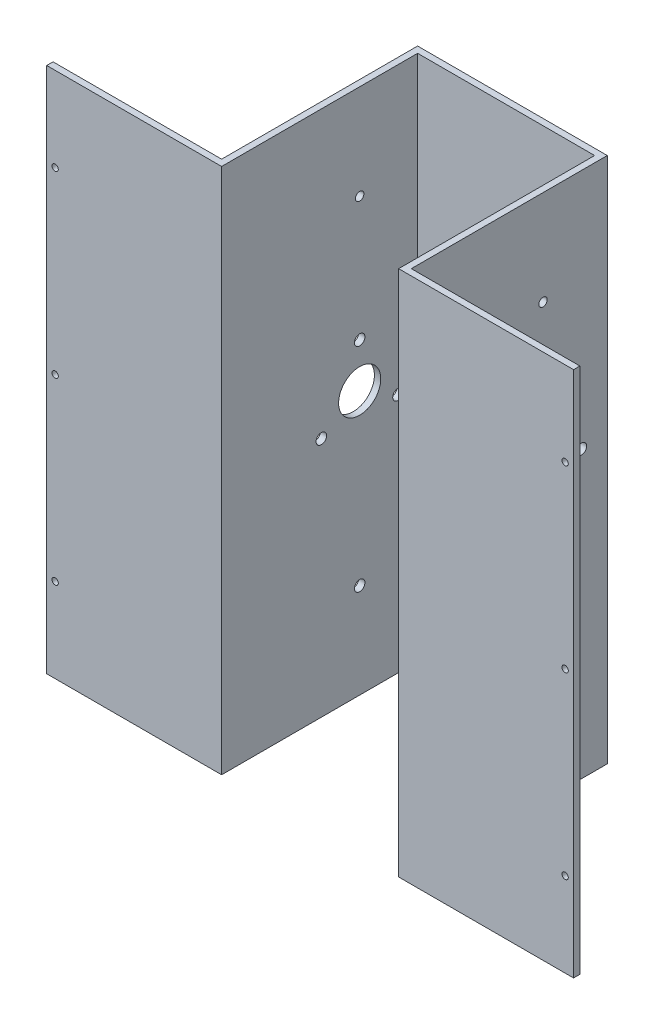
ISO-10303-21;
HEADER;
FILE_DESCRIPTION(('STEP AP214'),'2;1');
FILE_NAME('part.step','',(''),(''),'','','');
FILE_SCHEMA(('AUTOMOTIVE_DESIGN { 1 0 10303 214 1 1 1 1 }'));
ENDSEC;
DATA;
#1=APPLICATION_CONTEXT('core data for automotive mechanical design processes');
#2=APPLICATION_PROTOCOL_DEFINITION('international standard','automotive_design',2000,#1);
#3=PRODUCT_CONTEXT('',#1,'mechanical');
#4=PRODUCT('Part','Part','',(#3));
#5=PRODUCT_RELATED_PRODUCT_CATEGORY('part','',(#4));
#6=PRODUCT_DEFINITION_FORMATION('','',#4);
#7=PRODUCT_DEFINITION_CONTEXT('part definition',#1,'design');
#8=PRODUCT_DEFINITION('design','',#6,#7);
#9=PRODUCT_DEFINITION_SHAPE('','',#8);
#10=(LENGTH_UNIT() NAMED_UNIT(*) SI_UNIT(.MILLI.,.METRE.));
#11=(NAMED_UNIT(*) PLANE_ANGLE_UNIT() SI_UNIT($,.RADIAN.));
#12=(NAMED_UNIT(*) SI_UNIT($,.STERADIAN.) SOLID_ANGLE_UNIT());
#13=UNCERTAINTY_MEASURE_WITH_UNIT(LENGTH_MEASURE(1.E-05),#10,'distance_accuracy_value','');
#14=(GEOMETRIC_REPRESENTATION_CONTEXT(3) GLOBAL_UNCERTAINTY_ASSIGNED_CONTEXT((#13)) GLOBAL_UNIT_ASSIGNED_CONTEXT((#10,
#11,#12)) REPRESENTATION_CONTEXT('',''));
#15=CARTESIAN_POINT('',(0.,0.,0.));
#16=DIRECTION('',(0.,0.,1.));
#17=DIRECTION('',(1.,0.,0.));
#18=AXIS2_PLACEMENT_3D('',#15,#16,#17);
#19=CARTESIAN_POINT('',(40.1289777943499,0.,96.));
#20=DIRECTION('',(0.,0.,-1.));
#21=DIRECTION('',(1.,0.,0.));
#22=AXIS2_PLACEMENT_3D('',#19,#20,#21);
#23=PLANE('',#22);
#24=CARTESIAN_POINT('',(141.064488897175,-165.979780033841,96.));
#25=DIRECTION('',(0.,0.,-1.));
#26=DIRECTION('',(-1.,0.,0.));
#27=AXIS2_PLACEMENT_3D('',#24,#25,#26);
#28=CIRCLE('',#27,1.5);
#29=CARTESIAN_POINT('',(139.564488897175,-165.979780033841,96.));
#30=VERTEX_POINT('',#29);
#31=EDGE_CURVE('E702',#30,#30,#28,.T.);
#32=ORIENTED_EDGE('',*,*,#31,.T.);
#33=EDGE_LOOP('',(#32));
#34=FACE_BOUND('',#33,.T.);
#35=DIRECTION('',(0.,1.,0.));
#36=VECTOR('',#35,1.);
#37=CARTESIAN_POINT('',(62.0644888971749,44.0202199661591,96.));
#38=LINE('',#37,#36);
#39=CARTESIAN_POINT('',(62.064488897175,-205.979780033841,96.));
#40=VERTEX_POINT('',#39);
#41=CARTESIAN_POINT('',(62.0644888971749,44.0202199661591,96.));
#42=VERTEX_POINT('',#41);
#43=EDGE_CURVE('E128',#40,#42,#38,.T.);
#44=ORIENTED_EDGE('',*,*,#43,.F.);
#45=DIRECTION('',(-1.,0.,0.));
#46=VECTOR('',#45,1.);
#47=CARTESIAN_POINT('',(62.064488897175,-205.979780033841,96.));
#48=LINE('',#47,#46);
#49=CARTESIAN_POINT('',(145.064488897175,-205.979780033841,96.));
#50=VERTEX_POINT('',#49);
#51=EDGE_CURVE('E141',#50,#40,#48,.T.);
#52=ORIENTED_EDGE('',*,*,#51,.F.);
#53=DIRECTION('',(0.,-1.,0.));
#54=VECTOR('',#53,1.);
#55=CARTESIAN_POINT('',(145.064488897175,44.0202199661591,96.));
#56=LINE('',#55,#54);
#57=CARTESIAN_POINT('',(145.064488897175,44.0202199661591,96.));
#58=VERTEX_POINT('',#57);
#59=EDGE_CURVE('E150',#58,#50,#56,.T.);
#60=ORIENTED_EDGE('',*,*,#59,.F.);
#61=DIRECTION('',(1.,0.,0.));
#62=VECTOR('',#61,1.);
#63=CARTESIAN_POINT('',(62.0644888971749,44.0202199661591,96.));
#64=LINE('',#63,#62);
#65=EDGE_CURVE('E144',#42,#58,#64,.T.);
#66=ORIENTED_EDGE('',*,*,#65,.F.);
#67=EDGE_LOOP('',(#44,#52,#60,#66));
#68=FACE_BOUND('',#67,.T.);
#69=CARTESIAN_POINT('',(141.064488897175,-80.9797800338409,96.));
#70=DIRECTION('',(0.,0.,-1.));
#71=DIRECTION('',(-1.,0.,0.));
#72=AXIS2_PLACEMENT_3D('',#69,#70,#71);
#73=CIRCLE('',#72,1.5);
#74=CARTESIAN_POINT('',(139.564488897175,-80.9797800338409,96.));
#75=VERTEX_POINT('',#74);
#76=EDGE_CURVE('E708',#75,#75,#73,.T.);
#77=ORIENTED_EDGE('',*,*,#76,.T.);
#78=EDGE_LOOP('',(#77));
#79=FACE_BOUND('',#78,.T.);
#80=CARTESIAN_POINT('',(141.064488897175,4.02021996615911,96.));
#81=DIRECTION('',(0.,0.,-1.));
#82=DIRECTION('',(-1.,0.,0.));
#83=AXIS2_PLACEMENT_3D('',#80,#81,#82);
#84=CIRCLE('',#83,1.5);
#85=CARTESIAN_POINT('',(139.564488897175,4.02021996615911,96.));
#86=VERTEX_POINT('',#85);
#87=EDGE_CURVE('E696',#86,#86,#84,.T.);
#88=ORIENTED_EDGE('',*,*,#87,.T.);
#89=EDGE_LOOP('',(#88));
#90=FACE_BOUND('',#89,.T.);
#91=ADVANCED_FACE('F33',(#34,#68,#79,#90),#23,.F.);
#92=CARTESIAN_POINT('',(40.1289777943499,0.,93.));
#93=DIRECTION('',(0.,0.,-1.));
#94=DIRECTION('',(1.,0.,0.));
#95=AXIS2_PLACEMENT_3D('',#92,#93,#94);
#96=PLANE('',#95);
#97=CARTESIAN_POINT('',(141.064488897175,-165.979780033841,93.));
#98=DIRECTION('',(0.,0.,-1.));
#99=DIRECTION('',(-1.,0.,0.));
#100=AXIS2_PLACEMENT_3D('',#97,#98,#99);
#101=CIRCLE('',#100,1.5);
#102=CARTESIAN_POINT('',(139.564488897175,-165.979780033841,93.));
#103=VERTEX_POINT('',#102);
#104=EDGE_CURVE('E705',#103,#103,#101,.T.);
#105=ORIENTED_EDGE('',*,*,#104,.F.);
#106=EDGE_LOOP('',(#105));
#107=FACE_BOUND('',#106,.T.);
#108=DIRECTION('',(-1.,0.,0.));
#109=VECTOR('',#108,1.);
#110=CARTESIAN_POINT('',(62.064488897175,-205.979780033841,93.));
#111=LINE('',#110,#109);
#112=CARTESIAN_POINT('',(145.064488897175,-205.979780033841,93.));
#113=VERTEX_POINT('',#112);
#114=CARTESIAN_POINT('',(65.064488897175,-205.979780033841,93.));
#115=VERTEX_POINT('',#114);
#116=EDGE_CURVE('E157',#113,#115,#111,.T.);
#117=ORIENTED_EDGE('',*,*,#116,.T.);
#118=DIRECTION('',(0.,-1.,0.));
#119=VECTOR('',#118,1.);
#120=CARTESIAN_POINT('',(65.0644888971749,44.0202199661591,93.));
#121=LINE('',#120,#119);
#122=CARTESIAN_POINT('',(65.0644888971749,44.0202199661591,93.));
#123=VERTEX_POINT('',#122);
#124=EDGE_CURVE('E135',#123,#115,#121,.T.);
#125=ORIENTED_EDGE('',*,*,#124,.F.);
#126=DIRECTION('',(1.,0.,0.));
#127=VECTOR('',#126,1.);
#128=CARTESIAN_POINT('',(62.0644888971749,44.0202199661591,93.));
#129=LINE('',#128,#127);
#130=CARTESIAN_POINT('',(145.064488897175,44.0202199661591,93.));
#131=VERTEX_POINT('',#130);
#132=EDGE_CURVE('E145',#123,#131,#129,.T.);
#133=ORIENTED_EDGE('',*,*,#132,.T.);
#134=DIRECTION('',(0.,-1.,0.));
#135=VECTOR('',#134,1.);
#136=CARTESIAN_POINT('',(145.064488897175,44.0202199661591,93.));
#137=LINE('',#136,#135);
#138=EDGE_CURVE('E159',#131,#113,#137,.T.);
#139=ORIENTED_EDGE('',*,*,#138,.T.);
#140=EDGE_LOOP('',(#117,#125,#133,#139));
#141=FACE_BOUND('',#140,.T.);
#142=CARTESIAN_POINT('',(141.064488897175,-80.9797800338409,93.));
#143=DIRECTION('',(0.,0.,-1.));
#144=DIRECTION('',(-1.,0.,0.));
#145=AXIS2_PLACEMENT_3D('',#142,#143,#144);
#146=CIRCLE('',#145,1.5);
#147=CARTESIAN_POINT('',(139.564488897175,-80.9797800338409,93.));
#148=VERTEX_POINT('',#147);
#149=EDGE_CURVE('E160',#148,#148,#146,.T.);
#150=ORIENTED_EDGE('',*,*,#149,.F.);
#151=EDGE_LOOP('',(#150));
#152=FACE_BOUND('',#151,.T.);
#153=CARTESIAN_POINT('',(141.064488897175,4.02021996615911,93.));
#154=DIRECTION('',(0.,0.,-1.));
#155=DIRECTION('',(-1.,0.,0.));
#156=AXIS2_PLACEMENT_3D('',#153,#154,#155);
#157=CIRCLE('',#156,1.5);
#158=CARTESIAN_POINT('',(139.564488897175,4.02021996615911,93.));
#159=VERTEX_POINT('',#158);
#160=EDGE_CURVE('E699',#159,#159,#157,.T.);
#161=ORIENTED_EDGE('',*,*,#160,.F.);
#162=EDGE_LOOP('',(#161));
#163=FACE_BOUND('',#162,.T.);
#164=ADVANCED_FACE('F301',(#107,#141,#152,#163),#96,.T.);
#165=CARTESIAN_POINT('',(-24.9355111028251,44.0202199661591,3.));
#166=DIRECTION('',(1.,0.,0.));
#167=DIRECTION('',(0.,1.,0.));
#168=AXIS2_PLACEMENT_3D('',#165,#166,#167);
#169=PLANE('',#168);
#170=CARTESIAN_POINT('',(-24.9355111028251,-91.4797800338417,48.6865334794728));
#171=DIRECTION('',(-1.,0.,0.));
#172=DIRECTION('',(0.,-1.,0.));
#173=AXIS2_PLACEMENT_3D('',#170,#171,#172);
#174=CIRCLE('',#173,2.50000000000011);
#175=CARTESIAN_POINT('',(-24.9355111028251,-93.9797800338418,48.6865334794728));
#176=VERTEX_POINT('',#175);
#177=EDGE_CURVE('E196',#176,#176,#174,.T.);
#178=ORIENTED_EDGE('',*,*,#177,.F.);
#179=EDGE_LOOP('',(#178));
#180=FACE_BOUND('',#179,.T.);
#181=CARTESIAN_POINT('',(-24.9355111028251,-91.4797800338404,12.3134665205265));
#182=DIRECTION('',(-1.,0.,0.));
#183=DIRECTION('',(0.,-1.,0.));
#184=AXIS2_PLACEMENT_3D('',#181,#182,#183);
#185=CIRCLE('',#184,2.50000000000012);
#186=CARTESIAN_POINT('',(-24.9355111028251,-93.9797800338405,12.3134665205265));
#187=VERTEX_POINT('',#186);
#188=EDGE_CURVE('E202',#187,#187,#185,.T.);
#189=ORIENTED_EDGE('',*,*,#188,.F.);
#190=EDGE_LOOP('',(#189));
#191=FACE_BOUND('',#190,.T.);
#192=CARTESIAN_POINT('',(-24.9355111028251,-59.9797800338409,30.5000000000008));
#193=DIRECTION('',(-1.,0.,0.));
#194=DIRECTION('',(0.,-1.,0.));
#195=AXIS2_PLACEMENT_3D('',#192,#193,#194);
#196=CIRCLE('',#195,2.50000000000012);
#197=CARTESIAN_POINT('',(-24.9355111028251,-62.479780033841,30.5000000000008));
#198=VERTEX_POINT('',#197);
#199=EDGE_CURVE('E208',#198,#198,#196,.T.);
#200=ORIENTED_EDGE('',*,*,#199,.F.);
#201=EDGE_LOOP('',(#200));
#202=FACE_BOUND('',#201,.T.);
#203=CARTESIAN_POINT('',(-24.9355111028251,-160.97978003384,30.4999999999963));
#204=DIRECTION('',(-1.,0.,0.));
#205=DIRECTION('',(0.,-1.,0.));
#206=AXIS2_PLACEMENT_3D('',#203,#204,#205);
#207=CIRCLE('',#206,2.50000000000328);
#208=CARTESIAN_POINT('',(-24.9355111028251,-163.479780033844,30.4999999999963));
#209=VERTEX_POINT('',#208);
#210=EDGE_CURVE('E214',#209,#209,#207,.T.);
#211=ORIENTED_EDGE('',*,*,#210,.F.);
#212=EDGE_LOOP('',(#211));
#213=FACE_BOUND('',#212,.T.);
#214=CARTESIAN_POINT('',(-24.9355111028251,-80.9797800338409,30.5));
#215=DIRECTION('',(-1.,0.,0.));
#216=DIRECTION('',(0.,-1.,0.));
#217=AXIS2_PLACEMENT_3D('',#214,#215,#216);
#218=CIRCLE('',#217,9.99999999999999);
#219=CARTESIAN_POINT('',(-24.9355111028251,-90.9797800338409,30.5));
#220=VERTEX_POINT('',#219);
#221=EDGE_CURVE('E220',#220,#220,#218,.T.);
#222=ORIENTED_EDGE('',*,*,#221,.F.);
#223=EDGE_LOOP('',(#222));
#224=FACE_BOUND('',#223,.T.);
#225=CARTESIAN_POINT('',(-24.9355111028251,-0.979780033840474,30.4999999999963));
#226=DIRECTION('',(-1.,0.,0.));
#227=DIRECTION('',(0.,-1.,0.));
#228=AXIS2_PLACEMENT_3D('',#225,#226,#227);
#229=CIRCLE('',#228,2.00000000000327);
#230=CARTESIAN_POINT('',(-24.9355111028251,-2.97978003384375,30.4999999999963));
#231=VERTEX_POINT('',#230);
#232=EDGE_CURVE('E226',#231,#231,#229,.T.);
#233=ORIENTED_EDGE('',*,*,#232,.F.);
#234=EDGE_LOOP('',(#233));
#235=FACE_BOUND('',#234,.T.);
#236=DIRECTION('',(0.,-1.,0.));
#237=VECTOR('',#236,1.);
#238=CARTESIAN_POINT('',(-24.9355111028251,44.0202199661591,0.));
#239=LINE('',#238,#237);
#240=CARTESIAN_POINT('',(-24.9355111028251,44.0202199661591,0.));
#241=VERTEX_POINT('',#240);
#242=CARTESIAN_POINT('',(-24.935511102825,-205.979780033841,0.));
#243=VERTEX_POINT('',#242);
#244=EDGE_CURVE('E283',#241,#243,#239,.T.);
#245=ORIENTED_EDGE('',*,*,#244,.T.);
#246=DIRECTION('',(0.,0.,-1.));
#247=VECTOR('',#246,1.);
#248=CARTESIAN_POINT('',(-24.935511102825,-205.979780033841,3.));
#249=LINE('',#248,#247);
#250=CARTESIAN_POINT('',(-24.9355111028251,-205.979780033841,93.));
#251=VERTEX_POINT('',#250);
#252=EDGE_CURVE('E11',#251,#243,#249,.T.);
#253=ORIENTED_EDGE('',*,*,#252,.F.);
#254=DIRECTION('',(0.,-1.,0.));
#255=VECTOR('',#254,1.);
#256=CARTESIAN_POINT('',(-24.9355111028251,44.0202199661591,93.));
#257=LINE('',#256,#255);
#258=CARTESIAN_POINT('',(-24.9355111028251,44.0202199661591,93.));
#259=VERTEX_POINT('',#258);
#260=EDGE_CURVE('E260',#259,#251,#257,.T.);
#261=ORIENTED_EDGE('',*,*,#260,.F.);
#262=DIRECTION('',(0.,0.,-1.));
#263=VECTOR('',#262,1.);
#264=CARTESIAN_POINT('',(-24.9355111028251,44.0202199661591,3.));
#265=LINE('',#264,#263);
#266=EDGE_CURVE('E42',#259,#241,#265,.T.);
#267=ORIENTED_EDGE('',*,*,#266,.T.);
#268=EDGE_LOOP('',(#245,#253,#261,#267));
#269=FACE_BOUND('',#268,.T.);
#270=ADVANCED_FACE('F35',(#180,#191,#202,#213,#224,#235,#269),#169,.F.);
#271=CARTESIAN_POINT('',(-24.935511102825,-205.979780033841,3.));
#272=DIRECTION('',(0.,1.,0.));
#273=DIRECTION('',(0.,0.,1.));
#274=AXIS2_PLACEMENT_3D('',#271,#272,#273);
#275=PLANE('',#274);
#276=DIRECTION('',(1.,0.,0.));
#277=VECTOR('',#276,1.);
#278=CARTESIAN_POINT('',(-24.935511102825,-205.979780033841,0.));
#279=LINE('',#278,#277);
#280=CARTESIAN_POINT('',(65.064488897175,-205.979780033841,0.));
#281=VERTEX_POINT('',#280);
#282=EDGE_CURVE('E285',#243,#281,#279,.T.);
#283=ORIENTED_EDGE('',*,*,#282,.T.);
#284=DIRECTION('',(0.,0.,-1.));
#285=VECTOR('',#284,1.);
#286=CARTESIAN_POINT('',(65.064488897175,-205.979780033841,3.));
#287=LINE('',#286,#285);
#288=EDGE_CURVE('E174',#115,#281,#287,.T.);
#289=ORIENTED_EDGE('',*,*,#288,.F.);
#290=ORIENTED_EDGE('',*,*,#116,.F.);
#291=DIRECTION('',(0.,0.,-1.));
#292=VECTOR('',#291,1.);
#293=CARTESIAN_POINT('',(145.064488897175,-205.979780033841,96.));
#294=LINE('',#293,#292);
#295=EDGE_CURVE('E149',#50,#113,#294,.T.);
#296=ORIENTED_EDGE('',*,*,#295,.F.);
#297=ORIENTED_EDGE('',*,*,#51,.T.);
#298=DIRECTION('',(0.,0.,-1.));
#299=VECTOR('',#298,1.);
#300=CARTESIAN_POINT('',(62.064488897175,-205.979780033841,93.));
#301=LINE('',#300,#299);
#302=CARTESIAN_POINT('',(62.064488897175,-205.979780033841,3.));
#303=VERTEX_POINT('',#302);
#304=EDGE_CURVE('E125',#40,#303,#301,.T.);
#305=ORIENTED_EDGE('',*,*,#304,.T.);
#306=DIRECTION('',(1.,0.,0.));
#307=VECTOR('',#306,1.);
#308=CARTESIAN_POINT('',(-24.935511102825,-205.979780033841,3.));
#309=LINE('',#308,#307);
#310=CARTESIAN_POINT('',(-21.9355111028251,-205.979780033841,3.));
#311=VERTEX_POINT('',#310);
#312=EDGE_CURVE('E270',#311,#303,#309,.T.);
#313=ORIENTED_EDGE('',*,*,#312,.F.);
#314=DIRECTION('',(0.,0.,-1.));
#315=VECTOR('',#314,1.);
#316=CARTESIAN_POINT('',(-21.935511102825,-205.979780033841,93.));
#317=LINE('',#316,#315);
#318=CARTESIAN_POINT('',(-21.935511102825,-205.979780033841,96.));
#319=VERTEX_POINT('',#318);
#320=EDGE_CURVE('E286',#319,#311,#317,.T.);
#321=ORIENTED_EDGE('',*,*,#320,.F.);
#322=DIRECTION('',(1.,0.,0.));
#323=VECTOR('',#322,1.);
#324=CARTESIAN_POINT('',(-21.935511102825,-205.979780033841,96.));
#325=LINE('',#324,#323);
#326=CARTESIAN_POINT('',(-104.935511102825,-205.979780033841,96.));
#327=VERTEX_POINT('',#326);
#328=EDGE_CURVE('E243',#327,#319,#325,.T.);
#329=ORIENTED_EDGE('',*,*,#328,.F.);
#330=DIRECTION('',(0.,0.,-1.));
#331=VECTOR('',#330,1.);
#332=CARTESIAN_POINT('',(-104.935511102825,-205.979780033841,96.));
#333=LINE('',#332,#331);
#334=CARTESIAN_POINT('',(-104.935511102825,-205.979780033841,93.));
#335=VERTEX_POINT('',#334);
#336=EDGE_CURVE('E246',#327,#335,#333,.T.);
#337=ORIENTED_EDGE('',*,*,#336,.T.);
#338=DIRECTION('',(1.,0.,0.));
#339=VECTOR('',#338,1.);
#340=CARTESIAN_POINT('',(-21.935511102825,-205.979780033841,93.));
#341=LINE('',#340,#339);
#342=EDGE_CURVE('E239',#335,#251,#341,.T.);
#343=ORIENTED_EDGE('',*,*,#342,.T.);
#344=ORIENTED_EDGE('',*,*,#252,.T.);
#345=EDGE_LOOP('',(#283,#289,#290,#296,#297,#305,#313,#321,#329,#337,#343,#344));
#346=FACE_BOUND('',#345,.T.);
#347=ADVANCED_FACE('F147',(#346),#275,.F.);
#348=CARTESIAN_POINT('',(-24.9355111028251,44.0202199661591,3.));
#349=DIRECTION('',(0.,1.,0.));
#350=DIRECTION('',(0.,0.,1.));
#351=AXIS2_PLACEMENT_3D('',#348,#349,#350);
#352=PLANE('',#351);
#353=DIRECTION('',(1.,0.,0.));
#354=VECTOR('',#353,1.);
#355=CARTESIAN_POINT('',(-24.9355111028251,44.0202199661591,0.));
#356=LINE('',#355,#354);
#357=CARTESIAN_POINT('',(65.0644888971749,44.0202199661591,0.));
#358=VERTEX_POINT('',#357);
#359=EDGE_CURVE('E274',#241,#358,#356,.T.);
#360=ORIENTED_EDGE('',*,*,#359,.F.);
#361=ORIENTED_EDGE('',*,*,#266,.F.);
#362=DIRECTION('',(-1.,0.,0.));
#363=VECTOR('',#362,1.);
#364=CARTESIAN_POINT('',(-21.9355111028251,44.0202199661591,93.));
#365=LINE('',#364,#363);
#366=CARTESIAN_POINT('',(-104.935511102825,44.0202199661591,93.));
#367=VERTEX_POINT('',#366);
#368=EDGE_CURVE('E232',#259,#367,#365,.T.);
#369=ORIENTED_EDGE('',*,*,#368,.T.);
#370=DIRECTION('',(0.,0.,-1.));
#371=VECTOR('',#370,1.);
#372=CARTESIAN_POINT('',(-104.935511102825,44.0202199661591,96.));
#373=LINE('',#372,#371);
#374=CARTESIAN_POINT('',(-104.935511102825,44.0202199661591,96.));
#375=VERTEX_POINT('',#374);
#376=EDGE_CURVE('E735',#375,#367,#373,.T.);
#377=ORIENTED_EDGE('',*,*,#376,.F.);
#378=DIRECTION('',(-1.,0.,0.));
#379=VECTOR('',#378,1.);
#380=CARTESIAN_POINT('',(-21.9355111028251,44.0202199661591,96.));
#381=LINE('',#380,#379);
#382=CARTESIAN_POINT('',(-21.9355111028251,44.0202199661591,96.));
#383=VERTEX_POINT('',#382);
#384=EDGE_CURVE('E238',#383,#375,#381,.T.);
#385=ORIENTED_EDGE('',*,*,#384,.F.);
#386=DIRECTION('',(0.,0.,-1.));
#387=VECTOR('',#386,1.);
#388=CARTESIAN_POINT('',(-21.9355111028251,44.0202199661591,93.));
#389=LINE('',#388,#387);
#390=CARTESIAN_POINT('',(-21.9355111028251,44.0202199661591,3.));
#391=VERTEX_POINT('',#390);
#392=EDGE_CURVE('E263',#383,#391,#389,.T.);
#393=ORIENTED_EDGE('',*,*,#392,.T.);
#394=DIRECTION('',(1.,0.,0.));
#395=VECTOR('',#394,1.);
#396=CARTESIAN_POINT('',(-24.9355111028251,44.0202199661591,3.));
#397=LINE('',#396,#395);
#398=CARTESIAN_POINT('',(62.0644888971749,44.0202199661591,3.));
#399=VERTEX_POINT('',#398);
#400=EDGE_CURVE('E268',#391,#399,#397,.T.);
#401=ORIENTED_EDGE('',*,*,#400,.T.);
#402=DIRECTION('',(0.,0.,-1.));
#403=VECTOR('',#402,1.);
#404=CARTESIAN_POINT('',(62.0644888971749,44.0202199661591,93.));
#405=LINE('',#404,#403);
#406=EDGE_CURVE('E134',#42,#399,#405,.T.);
#407=ORIENTED_EDGE('',*,*,#406,.F.);
#408=ORIENTED_EDGE('',*,*,#65,.T.);
#409=DIRECTION('',(0.,0.,-1.));
#410=VECTOR('',#409,1.);
#411=CARTESIAN_POINT('',(145.064488897175,44.0202199661591,96.));
#412=LINE('',#411,#410);
#413=EDGE_CURVE('E156',#58,#131,#412,.T.);
#414=ORIENTED_EDGE('',*,*,#413,.T.);
#415=ORIENTED_EDGE('',*,*,#132,.F.);
#416=DIRECTION('',(0.,0.,-1.));
#417=VECTOR('',#416,1.);
#418=CARTESIAN_POINT('',(65.0644888971749,44.0202199661591,3.));
#419=LINE('',#418,#417);
#420=EDGE_CURVE('E177',#123,#358,#419,.T.);
#421=ORIENTED_EDGE('',*,*,#420,.T.);
#422=EDGE_LOOP('',(#360,#361,#369,#377,#385,#393,#401,#407,#408,#414,#415,#421));
#423=FACE_BOUND('',#422,.T.);
#424=ADVANCED_FACE('F292',(#423),#352,.T.);
#425=CARTESIAN_POINT('',(0.,0.,3.));
#426=DIRECTION('',(0.,0.,1.));
#427=DIRECTION('',(1.,0.,0.));
#428=AXIS2_PLACEMENT_3D('',#425,#426,#427);
#429=PLANE('',#428);
#430=DIRECTION('',(0.,1.,0.));
#431=VECTOR('',#430,1.);
#432=CARTESIAN_POINT('',(62.0644888971749,44.0202199661591,3.));
#433=LINE('',#432,#431);
#434=EDGE_CURVE('E131',#303,#399,#433,.T.);
#435=ORIENTED_EDGE('',*,*,#434,.T.);
#436=ORIENTED_EDGE('',*,*,#400,.F.);
#437=DIRECTION('',(0.,1.,0.));
#438=VECTOR('',#437,1.);
#439=CARTESIAN_POINT('',(-21.9355111028251,44.0202199661591,3.));
#440=LINE('',#439,#438);
#441=EDGE_CURVE('E50',#311,#391,#440,.T.);
#442=ORIENTED_EDGE('',*,*,#441,.F.);
#443=ORIENTED_EDGE('',*,*,#312,.T.);
#444=EDGE_LOOP('',(#435,#436,#442,#443));
#445=FACE_BOUND('',#444,.T.);
#446=ADVANCED_FACE('F383',(#445),#429,.T.);
#447=CARTESIAN_POINT('',(0.,0.,0.));
#448=DIRECTION('',(0.,0.,1.));
#449=DIRECTION('',(1.,0.,0.));
#450=AXIS2_PLACEMENT_3D('',#447,#448,#449);
#451=PLANE('',#450);
#452=ORIENTED_EDGE('',*,*,#244,.F.);
#453=ORIENTED_EDGE('',*,*,#359,.T.);
#454=DIRECTION('',(0.,-1.,0.));
#455=VECTOR('',#454,1.);
#456=CARTESIAN_POINT('',(65.0644888971749,44.0202199661591,0.));
#457=LINE('',#456,#455);
#458=EDGE_CURVE('E171',#358,#281,#457,.T.);
#459=ORIENTED_EDGE('',*,*,#458,.T.);
#460=ORIENTED_EDGE('',*,*,#282,.F.);
#461=EDGE_LOOP('',(#452,#453,#459,#460));
#462=FACE_BOUND('',#461,.T.);
#463=ADVANCED_FACE('F289',(#462),#451,.F.);
#464=CARTESIAN_POINT('',(-21.9355111028251,44.0202199661591,93.));
#465=DIRECTION('',(-1.,0.,0.));
#466=DIRECTION('',(0.,-1.,0.));
#467=AXIS2_PLACEMENT_3D('',#464,#465,#466);
#468=PLANE('',#467);
#469=CARTESIAN_POINT('',(-21.9355111028251,-91.4797800338417,48.6865334794728));
#470=DIRECTION('',(-1.,0.,0.));
#471=DIRECTION('',(0.,-1.,0.));
#472=AXIS2_PLACEMENT_3D('',#469,#470,#471);
#473=CIRCLE('',#472,2.50000000000011);
#474=CARTESIAN_POINT('',(-21.9355111028251,-93.9797800338418,48.6865334794728));
#475=VERTEX_POINT('',#474);
#476=EDGE_CURVE('E199',#475,#475,#473,.T.);
#477=ORIENTED_EDGE('',*,*,#476,.T.);
#478=EDGE_LOOP('',(#477));
#479=FACE_BOUND('',#478,.T.);
#480=CARTESIAN_POINT('',(-21.9355111028251,-91.4797800338404,12.3134665205265));
#481=DIRECTION('',(-1.,0.,0.));
#482=DIRECTION('',(0.,-1.,0.));
#483=AXIS2_PLACEMENT_3D('',#480,#481,#482);
#484=CIRCLE('',#483,2.50000000000012);
#485=CARTESIAN_POINT('',(-21.9355111028251,-93.9797800338405,12.3134665205265));
#486=VERTEX_POINT('',#485);
#487=EDGE_CURVE('E205',#486,#486,#484,.T.);
#488=ORIENTED_EDGE('',*,*,#487,.T.);
#489=EDGE_LOOP('',(#488));
#490=FACE_BOUND('',#489,.T.);
#491=CARTESIAN_POINT('',(-21.9355111028251,-59.9797800338409,30.5000000000008));
#492=DIRECTION('',(-1.,0.,0.));
#493=DIRECTION('',(0.,-1.,0.));
#494=AXIS2_PLACEMENT_3D('',#491,#492,#493);
#495=CIRCLE('',#494,2.50000000000012);
#496=CARTESIAN_POINT('',(-21.9355111028251,-62.479780033841,30.5000000000008));
#497=VERTEX_POINT('',#496);
#498=EDGE_CURVE('E211',#497,#497,#495,.T.);
#499=ORIENTED_EDGE('',*,*,#498,.T.);
#500=EDGE_LOOP('',(#499));
#501=FACE_BOUND('',#500,.T.);
#502=CARTESIAN_POINT('',(-21.9355111028251,-160.97978003384,30.4999999999963));
#503=DIRECTION('',(-1.,0.,0.));
#504=DIRECTION('',(0.,-1.,0.));
#505=AXIS2_PLACEMENT_3D('',#502,#503,#504);
#506=CIRCLE('',#505,2.50000000000328);
#507=CARTESIAN_POINT('',(-21.9355111028251,-163.479780033844,30.4999999999963));
#508=VERTEX_POINT('',#507);
#509=EDGE_CURVE('E217',#508,#508,#506,.T.);
#510=ORIENTED_EDGE('',*,*,#509,.T.);
#511=EDGE_LOOP('',(#510));
#512=FACE_BOUND('',#511,.T.);
#513=CARTESIAN_POINT('',(-21.9355111028251,-80.9797800338409,30.5));
#514=DIRECTION('',(-1.,0.,0.));
#515=DIRECTION('',(0.,-1.,0.));
#516=AXIS2_PLACEMENT_3D('',#513,#514,#515);
#517=CIRCLE('',#516,9.99999999999999);
#518=CARTESIAN_POINT('',(-21.9355111028251,-90.9797800338409,30.5));
#519=VERTEX_POINT('',#518);
#520=EDGE_CURVE('E223',#519,#519,#517,.T.);
#521=ORIENTED_EDGE('',*,*,#520,.T.);
#522=EDGE_LOOP('',(#521));
#523=FACE_BOUND('',#522,.T.);
#524=CARTESIAN_POINT('',(-21.9355111028251,-0.979780033840474,30.4999999999963));
#525=DIRECTION('',(-1.,0.,0.));
#526=DIRECTION('',(0.,-1.,0.));
#527=AXIS2_PLACEMENT_3D('',#524,#525,#526);
#528=CIRCLE('',#527,2.00000000000327);
#529=CARTESIAN_POINT('',(-21.9355111028251,-2.97978003384375,30.4999999999963));
#530=VERTEX_POINT('',#529);
#531=EDGE_CURVE('E229',#530,#530,#528,.T.);
#532=ORIENTED_EDGE('',*,*,#531,.T.);
#533=EDGE_LOOP('',(#532));
#534=FACE_BOUND('',#533,.T.);
#535=ORIENTED_EDGE('',*,*,#441,.T.);
#536=ORIENTED_EDGE('',*,*,#392,.F.);
#537=DIRECTION('',(0.,1.,0.));
#538=VECTOR('',#537,1.);
#539=CARTESIAN_POINT('',(-21.9355111028251,44.0202199661591,96.));
#540=LINE('',#539,#538);
#541=EDGE_CURVE('E235',#319,#383,#540,.T.);
#542=ORIENTED_EDGE('',*,*,#541,.F.);
#543=ORIENTED_EDGE('',*,*,#320,.T.);
#544=EDGE_LOOP('',(#535,#536,#542,#543));
#545=FACE_BOUND('',#544,.T.);
#546=ADVANCED_FACE('F378',(#479,#490,#501,#512,#523,#534,#545),#468,.F.);
#547=CARTESIAN_POINT('',(-104.935511102825,44.0202199661591,96.));
#548=DIRECTION('',(1.,0.,0.));
#549=DIRECTION('',(0.,1.,0.));
#550=AXIS2_PLACEMENT_3D('',#547,#548,#549);
#551=PLANE('',#550);
#552=DIRECTION('',(0.,-1.,0.));
#553=VECTOR('',#552,1.);
#554=CARTESIAN_POINT('',(-104.935511102825,44.0202199661591,93.));
#555=LINE('',#554,#553);
#556=EDGE_CURVE('E249',#367,#335,#555,.T.);
#557=ORIENTED_EDGE('',*,*,#556,.T.);
#558=ORIENTED_EDGE('',*,*,#336,.F.);
#559=DIRECTION('',(0.,-1.,0.));
#560=VECTOR('',#559,1.);
#561=CARTESIAN_POINT('',(-104.935511102825,44.0202199661591,96.));
#562=LINE('',#561,#560);
#563=EDGE_CURVE('E241',#375,#327,#562,.T.);
#564=ORIENTED_EDGE('',*,*,#563,.F.);
#565=ORIENTED_EDGE('',*,*,#376,.T.);
#566=EDGE_LOOP('',(#557,#558,#564,#565));
#567=FACE_BOUND('',#566,.T.);
#568=ADVANCED_FACE('F371',(#567),#551,.F.);
#569=CARTESIAN_POINT('',(0.,0.,96.));
#570=DIRECTION('',(0.,0.,-1.));
#571=DIRECTION('',(-1.,0.,0.));
#572=AXIS2_PLACEMENT_3D('',#569,#570,#571);
#573=PLANE('',#572);
#574=CARTESIAN_POINT('',(-100.935511102825,4.02021996615907,96.));
#575=DIRECTION('',(0.,0.,1.));
#576=DIRECTION('',(1.,0.,0.));
#577=AXIS2_PLACEMENT_3D('',#574,#575,#576);
#578=CIRCLE('',#577,1.5);
#579=CARTESIAN_POINT('',(-99.4355111028251,4.02021996615907,96.));
#580=VERTEX_POINT('',#579);
#581=EDGE_CURVE('E181',#580,#580,#578,.T.);
#582=ORIENTED_EDGE('',*,*,#581,.F.);
#583=EDGE_LOOP('',(#582));
#584=FACE_BOUND('',#583,.T.);
#585=CARTESIAN_POINT('',(-100.935511102825,-165.979780033841,96.));
#586=DIRECTION('',(0.,0.,1.));
#587=DIRECTION('',(1.,0.,0.));
#588=AXIS2_PLACEMENT_3D('',#585,#586,#587);
#589=CIRCLE('',#588,1.5);
#590=CARTESIAN_POINT('',(-99.4355111028251,-165.979780033841,96.));
#591=VERTEX_POINT('',#590);
#592=EDGE_CURVE('E187',#591,#591,#589,.T.);
#593=ORIENTED_EDGE('',*,*,#592,.F.);
#594=EDGE_LOOP('',(#593));
#595=FACE_BOUND('',#594,.T.);
#596=CARTESIAN_POINT('',(-100.935511102825,-80.9797800338409,96.));
#597=DIRECTION('',(0.,0.,1.));
#598=DIRECTION('',(1.,0.,0.));
#599=AXIS2_PLACEMENT_3D('',#596,#597,#598);
#600=CIRCLE('',#599,1.5);
#601=CARTESIAN_POINT('',(-99.4355111028251,-80.9797800338409,96.));
#602=VERTEX_POINT('',#601);
#603=EDGE_CURVE('E190',#602,#602,#600,.T.);
#604=ORIENTED_EDGE('',*,*,#603,.F.);
#605=EDGE_LOOP('',(#604));
#606=FACE_BOUND('',#605,.T.);
#607=ORIENTED_EDGE('',*,*,#541,.T.);
#608=ORIENTED_EDGE('',*,*,#384,.T.);
#609=ORIENTED_EDGE('',*,*,#563,.T.);
#610=ORIENTED_EDGE('',*,*,#328,.T.);
#611=EDGE_LOOP('',(#607,#608,#609,#610));
#612=FACE_BOUND('',#611,.T.);
#613=ADVANCED_FACE('F368',(#584,#595,#606,#612),#573,.F.);
#614=CARTESIAN_POINT('',(0.,0.,93.));
#615=DIRECTION('',(0.,0.,-1.));
#616=DIRECTION('',(-1.,0.,0.));
#617=AXIS2_PLACEMENT_3D('',#614,#615,#616);
#618=PLANE('',#617);
#619=CARTESIAN_POINT('',(-100.935511102825,4.02021996615907,93.));
#620=DIRECTION('',(0.,0.,1.));
#621=DIRECTION('',(1.,0.,0.));
#622=AXIS2_PLACEMENT_3D('',#619,#620,#621);
#623=CIRCLE('',#622,1.5);
#624=CARTESIAN_POINT('',(-99.4355111028251,4.02021996615907,93.));
#625=VERTEX_POINT('',#624);
#626=EDGE_CURVE('E180',#625,#625,#623,.T.);
#627=ORIENTED_EDGE('',*,*,#626,.T.);
#628=EDGE_LOOP('',(#627));
#629=FACE_BOUND('',#628,.T.);
#630=CARTESIAN_POINT('',(-100.935511102825,-165.979780033841,93.));
#631=DIRECTION('',(0.,0.,1.));
#632=DIRECTION('',(1.,0.,0.));
#633=AXIS2_PLACEMENT_3D('',#630,#631,#632);
#634=CIRCLE('',#633,1.5);
#635=CARTESIAN_POINT('',(-99.4355111028251,-165.979780033841,93.));
#636=VERTEX_POINT('',#635);
#637=EDGE_CURVE('E184',#636,#636,#634,.T.);
#638=ORIENTED_EDGE('',*,*,#637,.T.);
#639=EDGE_LOOP('',(#638));
#640=FACE_BOUND('',#639,.T.);
#641=CARTESIAN_POINT('',(-100.935511102825,-80.9797800338409,93.));
#642=DIRECTION('',(0.,0.,1.));
#643=DIRECTION('',(1.,0.,0.));
#644=AXIS2_PLACEMENT_3D('',#641,#642,#643);
#645=CIRCLE('',#644,1.5);
#646=CARTESIAN_POINT('',(-99.4355111028251,-80.9797800338409,93.));
#647=VERTEX_POINT('',#646);
#648=EDGE_CURVE('E193',#647,#647,#645,.T.);
#649=ORIENTED_EDGE('',*,*,#648,.T.);
#650=EDGE_LOOP('',(#649));
#651=FACE_BOUND('',#650,.T.);
#652=ORIENTED_EDGE('',*,*,#368,.F.);
#653=ORIENTED_EDGE('',*,*,#260,.T.);
#654=ORIENTED_EDGE('',*,*,#342,.F.);
#655=ORIENTED_EDGE('',*,*,#556,.F.);
#656=EDGE_LOOP('',(#652,#653,#654,#655));
#657=FACE_BOUND('',#656,.T.);
#658=ADVANCED_FACE('F366',(#629,#640,#651,#657),#618,.T.);
#659=CARTESIAN_POINT('',(-21.9355111028251,-0.979780033840474,30.4999999999963));
#660=DIRECTION('',(-1.,0.,0.));
#661=DIRECTION('',(0.,-1.,0.));
#662=AXIS2_PLACEMENT_3D('',#659,#660,#661);
#663=CYLINDRICAL_SURFACE('',#662,2.00000000000327);
#664=ORIENTED_EDGE('',*,*,#531,.F.);
#665=EDGE_LOOP('',(#664));
#666=FACE_BOUND('',#665,.T.);
#667=ORIENTED_EDGE('',*,*,#232,.T.);
#668=EDGE_LOOP('',(#667));
#669=FACE_BOUND('',#668,.T.);
#670=ADVANCED_FACE('F362',(#666,#669),#663,.F.);
#671=CARTESIAN_POINT('',(-21.9355111028251,-80.9797800338409,30.5));
#672=DIRECTION('',(-1.,0.,0.));
#673=DIRECTION('',(0.,-1.,0.));
#674=AXIS2_PLACEMENT_3D('',#671,#672,#673);
#675=CYLINDRICAL_SURFACE('',#674,9.99999999999999);
#676=ORIENTED_EDGE('',*,*,#520,.F.);
#677=EDGE_LOOP('',(#676));
#678=FACE_BOUND('',#677,.T.);
#679=ORIENTED_EDGE('',*,*,#221,.T.);
#680=EDGE_LOOP('',(#679));
#681=FACE_BOUND('',#680,.T.);
#682=ADVANCED_FACE('F358',(#678,#681),#675,.F.);
#683=CARTESIAN_POINT('',(-21.9355111028251,-160.97978003384,30.4999999999963));
#684=DIRECTION('',(-1.,0.,0.));
#685=DIRECTION('',(0.,-1.,0.));
#686=AXIS2_PLACEMENT_3D('',#683,#684,#685);
#687=CYLINDRICAL_SURFACE('',#686,2.50000000000328);
#688=ORIENTED_EDGE('',*,*,#509,.F.);
#689=EDGE_LOOP('',(#688));
#690=FACE_BOUND('',#689,.T.);
#691=ORIENTED_EDGE('',*,*,#210,.T.);
#692=EDGE_LOOP('',(#691));
#693=FACE_BOUND('',#692,.T.);
#694=ADVANCED_FACE('F354',(#690,#693),#687,.F.);
#695=CARTESIAN_POINT('',(-21.9355111028251,-59.9797800338409,30.5000000000008));
#696=DIRECTION('',(-1.,0.,0.));
#697=DIRECTION('',(0.,-1.,0.));
#698=AXIS2_PLACEMENT_3D('',#695,#696,#697);
#699=CYLINDRICAL_SURFACE('',#698,2.50000000000012);
#700=ORIENTED_EDGE('',*,*,#498,.F.);
#701=EDGE_LOOP('',(#700));
#702=FACE_BOUND('',#701,.T.);
#703=ORIENTED_EDGE('',*,*,#199,.T.);
#704=EDGE_LOOP('',(#703));
#705=FACE_BOUND('',#704,.T.);
#706=ADVANCED_FACE('F350',(#702,#705),#699,.F.);
#707=CARTESIAN_POINT('',(-21.9355111028251,-91.4797800338404,12.3134665205265));
#708=DIRECTION('',(-1.,0.,0.));
#709=DIRECTION('',(0.,-1.,0.));
#710=AXIS2_PLACEMENT_3D('',#707,#708,#709);
#711=CYLINDRICAL_SURFACE('',#710,2.50000000000012);
#712=ORIENTED_EDGE('',*,*,#487,.F.);
#713=EDGE_LOOP('',(#712));
#714=FACE_BOUND('',#713,.T.);
#715=ORIENTED_EDGE('',*,*,#188,.T.);
#716=EDGE_LOOP('',(#715));
#717=FACE_BOUND('',#716,.T.);
#718=ADVANCED_FACE('F346',(#714,#717),#711,.F.);
#719=CARTESIAN_POINT('',(-21.9355111028251,-91.4797800338417,48.6865334794728));
#720=DIRECTION('',(-1.,0.,0.));
#721=DIRECTION('',(0.,-1.,0.));
#722=AXIS2_PLACEMENT_3D('',#719,#720,#721);
#723=CYLINDRICAL_SURFACE('',#722,2.50000000000011);
#724=ORIENTED_EDGE('',*,*,#476,.F.);
#725=EDGE_LOOP('',(#724));
#726=FACE_BOUND('',#725,.T.);
#727=ORIENTED_EDGE('',*,*,#177,.T.);
#728=EDGE_LOOP('',(#727));
#729=FACE_BOUND('',#728,.T.);
#730=ADVANCED_FACE('F342',(#726,#729),#723,.F.);
#731=CARTESIAN_POINT('',(-100.935511102825,-80.9797800338409,93.));
#732=DIRECTION('',(0.,0.,1.));
#733=DIRECTION('',(1.,0.,0.));
#734=AXIS2_PLACEMENT_3D('',#731,#732,#733);
#735=CYLINDRICAL_SURFACE('',#734,1.5);
#736=ORIENTED_EDGE('',*,*,#648,.F.);
#737=EDGE_LOOP('',(#736));
#738=FACE_BOUND('',#737,.T.);
#739=ORIENTED_EDGE('',*,*,#603,.T.);
#740=EDGE_LOOP('',(#739));
#741=FACE_BOUND('',#740,.T.);
#742=ADVANCED_FACE('F338',(#738,#741),#735,.F.);
#743=CARTESIAN_POINT('',(-100.935511102825,-165.979780033841,93.));
#744=DIRECTION('',(0.,0.,1.));
#745=DIRECTION('',(1.,0.,0.));
#746=AXIS2_PLACEMENT_3D('',#743,#744,#745);
#747=CYLINDRICAL_SURFACE('',#746,1.5);
#748=ORIENTED_EDGE('',*,*,#637,.F.);
#749=EDGE_LOOP('',(#748));
#750=FACE_BOUND('',#749,.T.);
#751=ORIENTED_EDGE('',*,*,#592,.T.);
#752=EDGE_LOOP('',(#751));
#753=FACE_BOUND('',#752,.T.);
#754=ADVANCED_FACE('F334',(#750,#753),#747,.F.);
#755=CARTESIAN_POINT('',(-100.935511102825,4.02021996615907,93.));
#756=DIRECTION('',(0.,0.,1.));
#757=DIRECTION('',(1.,0.,0.));
#758=AXIS2_PLACEMENT_3D('',#755,#756,#757);
#759=CYLINDRICAL_SURFACE('',#758,1.5);
#760=ORIENTED_EDGE('',*,*,#626,.F.);
#761=EDGE_LOOP('',(#760));
#762=FACE_BOUND('',#761,.T.);
#763=ORIENTED_EDGE('',*,*,#581,.T.);
#764=EDGE_LOOP('',(#763));
#765=FACE_BOUND('',#764,.T.);
#766=ADVANCED_FACE('F330',(#762,#765),#759,.F.);
#767=CARTESIAN_POINT('',(65.0644888971749,44.0202199661591,3.));
#768=DIRECTION('',(1.,0.,0.));
#769=DIRECTION('',(0.,1.,0.));
#770=AXIS2_PLACEMENT_3D('',#767,#768,#769);
#771=PLANE('',#770);
#772=CARTESIAN_POINT('',(65.064488897175,-70.4797800338409,12.3134665205268));
#773=DIRECTION('',(1.,0.,0.));
#774=DIRECTION('',(0.,1.,0.));
#775=AXIS2_PLACEMENT_3D('',#772,#773,#774);
#776=CIRCLE('',#775,2.5);
#777=CARTESIAN_POINT('',(65.064488897175,-67.9797800338409,12.3134665205268));
#778=VERTEX_POINT('',#777);
#779=EDGE_CURVE('E664',#778,#778,#776,.T.);
#780=ORIENTED_EDGE('',*,*,#779,.F.);
#781=EDGE_LOOP('',(#780));
#782=FACE_BOUND('',#781,.T.);
#783=CARTESIAN_POINT('',(65.064488897175,-70.4797800338413,48.6865334794731));
#784=DIRECTION('',(1.,0.,0.));
#785=DIRECTION('',(0.,1.,0.));
#786=AXIS2_PLACEMENT_3D('',#783,#784,#785);
#787=CIRCLE('',#786,2.5);
#788=CARTESIAN_POINT('',(65.064488897175,-67.9797800338413,48.6865334794731));
#789=VERTEX_POINT('',#788);
#790=EDGE_CURVE('E666',#789,#789,#787,.T.);
#791=ORIENTED_EDGE('',*,*,#790,.F.);
#792=EDGE_LOOP('',(#791));
#793=FACE_BOUND('',#792,.T.);
#794=CARTESIAN_POINT('',(65.064488897175,-101.979780033841,30.4999999999996));
#795=DIRECTION('',(1.,0.,0.));
#796=DIRECTION('',(0.,1.,0.));
#797=AXIS2_PLACEMENT_3D('',#794,#795,#796);
#798=CIRCLE('',#797,2.50000000000001);
#799=CARTESIAN_POINT('',(65.064488897175,-99.4797800338412,30.4999999999996));
#800=VERTEX_POINT('',#799);
#801=EDGE_CURVE('E672',#800,#800,#798,.T.);
#802=ORIENTED_EDGE('',*,*,#801,.F.);
#803=EDGE_LOOP('',(#802));
#804=FACE_BOUND('',#803,.T.);
#805=CARTESIAN_POINT('',(65.064488897175,-160.97978003384,30.4999999999968));
#806=DIRECTION('',(1.,0.,0.));
#807=DIRECTION('',(0.,1.,0.));
#808=AXIS2_PLACEMENT_3D('',#805,#806,#807);
#809=CIRCLE('',#808,2.49999999999691);
#810=CARTESIAN_POINT('',(65.064488897175,-158.479780033844,30.4999999999968));
#811=VERTEX_POINT('',#810);
#812=EDGE_CURVE('E678',#811,#811,#809,.T.);
#813=ORIENTED_EDGE('',*,*,#812,.F.);
#814=EDGE_LOOP('',(#813));
#815=FACE_BOUND('',#814,.T.);
#816=CARTESIAN_POINT('',(65.0644888971749,-0.979780033840454,30.4999999999963));
#817=DIRECTION('',(1.,0.,0.));
#818=DIRECTION('',(0.,1.,0.));
#819=AXIS2_PLACEMENT_3D('',#816,#817,#818);
#820=CIRCLE('',#819,1.99999999999645);
#821=CARTESIAN_POINT('',(65.0644888971749,1.020219966156,30.4999999999963));
#822=VERTEX_POINT('',#821);
#823=EDGE_CURVE('E684',#822,#822,#820,.T.);
#824=ORIENTED_EDGE('',*,*,#823,.F.);
#825=EDGE_LOOP('',(#824));
#826=FACE_BOUND('',#825,.T.);
#827=CARTESIAN_POINT('',(65.064488897175,-80.9797800338409,30.5));
#828=DIRECTION('',(1.,0.,0.));
#829=DIRECTION('',(0.,1.,0.));
#830=AXIS2_PLACEMENT_3D('',#827,#828,#829);
#831=CIRCLE('',#830,10.);
#832=CARTESIAN_POINT('',(65.064488897175,-70.9797800338409,30.5));
#833=VERTEX_POINT('',#832);
#834=EDGE_CURVE('E690',#833,#833,#831,.T.);
#835=ORIENTED_EDGE('',*,*,#834,.F.);
#836=EDGE_LOOP('',(#835));
#837=FACE_BOUND('',#836,.T.);
#838=ORIENTED_EDGE('',*,*,#458,.F.);
#839=ORIENTED_EDGE('',*,*,#420,.F.);
#840=ORIENTED_EDGE('',*,*,#124,.T.);
#841=ORIENTED_EDGE('',*,*,#288,.T.);
#842=EDGE_LOOP('',(#838,#839,#840,#841));
#843=FACE_BOUND('',#842,.T.);
#844=ADVANCED_FACE('F295',(#782,#793,#804,#815,#826,#837,#843),#771,.T.);
#845=CARTESIAN_POINT('',(62.0644888971749,44.0202199661591,93.));
#846=DIRECTION('',(-1.,0.,0.));
#847=DIRECTION('',(0.,-1.,0.));
#848=AXIS2_PLACEMENT_3D('',#845,#846,#847);
#849=PLANE('',#848);
#850=CARTESIAN_POINT('',(62.0644888971749,-70.4797800338409,12.3134665205268));
#851=DIRECTION('',(1.,0.,0.));
#852=DIRECTION('',(0.,1.,0.));
#853=AXIS2_PLACEMENT_3D('',#850,#851,#852);
#854=CIRCLE('',#853,2.5);
#855=CARTESIAN_POINT('',(62.0644888971749,-67.9797800338409,12.3134665205268));
#856=VERTEX_POINT('',#855);
#857=EDGE_CURVE('E661',#856,#856,#854,.T.);
#858=ORIENTED_EDGE('',*,*,#857,.T.);
#859=EDGE_LOOP('',(#858));
#860=FACE_BOUND('',#859,.T.);
#861=CARTESIAN_POINT('',(62.0644888971749,-70.4797800338413,48.6865334794731));
#862=DIRECTION('',(1.,0.,0.));
#863=DIRECTION('',(0.,1.,0.));
#864=AXIS2_PLACEMENT_3D('',#861,#862,#863);
#865=CIRCLE('',#864,2.5);
#866=CARTESIAN_POINT('',(62.0644888971749,-67.9797800338413,48.6865334794731));
#867=VERTEX_POINT('',#866);
#868=EDGE_CURVE('E669',#867,#867,#865,.T.);
#869=ORIENTED_EDGE('',*,*,#868,.T.);
#870=EDGE_LOOP('',(#869));
#871=FACE_BOUND('',#870,.T.);
#872=CARTESIAN_POINT('',(62.064488897175,-101.979780033841,30.4999999999996));
#873=DIRECTION('',(1.,0.,0.));
#874=DIRECTION('',(0.,1.,0.));
#875=AXIS2_PLACEMENT_3D('',#872,#873,#874);
#876=CIRCLE('',#875,2.50000000000001);
#877=CARTESIAN_POINT('',(62.064488897175,-99.4797800338412,30.4999999999996));
#878=VERTEX_POINT('',#877);
#879=EDGE_CURVE('E675',#878,#878,#876,.T.);
#880=ORIENTED_EDGE('',*,*,#879,.T.);
#881=EDGE_LOOP('',(#880));
#882=FACE_BOUND('',#881,.T.);
#883=CARTESIAN_POINT('',(62.064488897175,-160.97978003384,30.4999999999968));
#884=DIRECTION('',(1.,0.,0.));
#885=DIRECTION('',(0.,1.,0.));
#886=AXIS2_PLACEMENT_3D('',#883,#884,#885);
#887=CIRCLE('',#886,2.49999999999691);
#888=CARTESIAN_POINT('',(62.064488897175,-158.479780033844,30.4999999999968));
#889=VERTEX_POINT('',#888);
#890=EDGE_CURVE('E681',#889,#889,#887,.T.);
#891=ORIENTED_EDGE('',*,*,#890,.T.);
#892=EDGE_LOOP('',(#891));
#893=FACE_BOUND('',#892,.T.);
#894=CARTESIAN_POINT('',(62.0644888971749,-0.979780033840455,30.4999999999963));
#895=DIRECTION('',(1.,0.,0.));
#896=DIRECTION('',(0.,1.,0.));
#897=AXIS2_PLACEMENT_3D('',#894,#895,#896);
#898=CIRCLE('',#897,1.99999999999645);
#899=CARTESIAN_POINT('',(62.0644888971749,1.020219966156,30.4999999999963));
#900=VERTEX_POINT('',#899);
#901=EDGE_CURVE('E687',#900,#900,#898,.T.);
#902=ORIENTED_EDGE('',*,*,#901,.T.);
#903=EDGE_LOOP('',(#902));
#904=FACE_BOUND('',#903,.T.);
#905=CARTESIAN_POINT('',(62.0644888971749,-80.9797800338409,30.5));
#906=DIRECTION('',(1.,0.,0.));
#907=DIRECTION('',(0.,1.,0.));
#908=AXIS2_PLACEMENT_3D('',#905,#906,#907);
#909=CIRCLE('',#908,10.);
#910=CARTESIAN_POINT('',(62.0644888971749,-70.9797800338409,30.5));
#911=VERTEX_POINT('',#910);
#912=EDGE_CURVE('E693',#911,#911,#909,.T.);
#913=ORIENTED_EDGE('',*,*,#912,.T.);
#914=EDGE_LOOP('',(#913));
#915=FACE_BOUND('',#914,.T.);
#916=ORIENTED_EDGE('',*,*,#434,.F.);
#917=ORIENTED_EDGE('',*,*,#304,.F.);
#918=ORIENTED_EDGE('',*,*,#43,.T.);
#919=ORIENTED_EDGE('',*,*,#406,.T.);
#920=EDGE_LOOP('',(#916,#917,#918,#919));
#921=FACE_BOUND('',#920,.T.);
#922=ADVANCED_FACE('F127',(#860,#871,#882,#893,#904,#915,#921),#849,.T.);
#923=CARTESIAN_POINT('',(145.064488897175,44.0202199661591,96.));
#924=DIRECTION('',(1.,0.,0.));
#925=DIRECTION('',(0.,1.,0.));
#926=AXIS2_PLACEMENT_3D('',#923,#924,#925);
#927=PLANE('',#926);
#928=ORIENTED_EDGE('',*,*,#138,.F.);
#929=ORIENTED_EDGE('',*,*,#413,.F.);
#930=ORIENTED_EDGE('',*,*,#59,.T.);
#931=ORIENTED_EDGE('',*,*,#295,.T.);
#932=EDGE_LOOP('',(#928,#929,#930,#931));
#933=FACE_BOUND('',#932,.T.);
#934=ADVANCED_FACE('F321',(#933),#927,.T.);
#935=CARTESIAN_POINT('',(141.064488897175,-80.9797800338409,93.));
#936=DIRECTION('',(0.,0.,1.));
#937=DIRECTION('',(1.,0.,0.));
#938=AXIS2_PLACEMENT_3D('',#935,#936,#937);
#939=CYLINDRICAL_SURFACE('',#938,1.5);
#940=ORIENTED_EDGE('',*,*,#149,.T.);
#941=EDGE_LOOP('',(#940));
#942=FACE_BOUND('',#941,.T.);
#943=ORIENTED_EDGE('',*,*,#76,.F.);
#944=EDGE_LOOP('',(#943));
#945=FACE_BOUND('',#944,.T.);
#946=ADVANCED_FACE('F318',(#942,#945),#939,.F.);
#947=CARTESIAN_POINT('',(141.064488897175,-165.979780033841,93.));
#948=DIRECTION('',(0.,0.,1.));
#949=DIRECTION('',(1.,0.,0.));
#950=AXIS2_PLACEMENT_3D('',#947,#948,#949);
#951=CYLINDRICAL_SURFACE('',#950,1.5);
#952=ORIENTED_EDGE('',*,*,#104,.T.);
#953=EDGE_LOOP('',(#952));
#954=FACE_BOUND('',#953,.T.);
#955=ORIENTED_EDGE('',*,*,#31,.F.);
#956=EDGE_LOOP('',(#955));
#957=FACE_BOUND('',#956,.T.);
#958=ADVANCED_FACE('F473',(#954,#957),#951,.F.);
#959=CARTESIAN_POINT('',(141.064488897175,4.02021996615911,93.));
#960=DIRECTION('',(0.,0.,1.));
#961=DIRECTION('',(1.,0.,0.));
#962=AXIS2_PLACEMENT_3D('',#959,#960,#961);
#963=CYLINDRICAL_SURFACE('',#962,1.5);
#964=ORIENTED_EDGE('',*,*,#160,.T.);
#965=EDGE_LOOP('',(#964));
#966=FACE_BOUND('',#965,.T.);
#967=ORIENTED_EDGE('',*,*,#87,.F.);
#968=EDGE_LOOP('',(#967));
#969=FACE_BOUND('',#968,.T.);
#970=ADVANCED_FACE('F480',(#966,#969),#963,.F.);
#971=CARTESIAN_POINT('',(62.0644888971749,-80.9797800338409,30.5));
#972=DIRECTION('',(1.,0.,0.));
#973=DIRECTION('',(0.,1.,0.));
#974=AXIS2_PLACEMENT_3D('',#971,#972,#973);
#975=CYLINDRICAL_SURFACE('',#974,10.);
#976=ORIENTED_EDGE('',*,*,#912,.F.);
#977=EDGE_LOOP('',(#976));
#978=FACE_BOUND('',#977,.T.);
#979=ORIENTED_EDGE('',*,*,#834,.T.);
#980=EDGE_LOOP('',(#979));
#981=FACE_BOUND('',#980,.T.);
#982=ADVANCED_FACE('F486',(#978,#981),#975,.F.);
#983=CARTESIAN_POINT('',(62.0644888971749,-0.979780033840455,30.4999999999963));
#984=DIRECTION('',(1.,0.,0.));
#985=DIRECTION('',(0.,1.,0.));
#986=AXIS2_PLACEMENT_3D('',#983,#984,#985);
#987=CYLINDRICAL_SURFACE('',#986,1.99999999999645);
#988=ORIENTED_EDGE('',*,*,#901,.F.);
#989=EDGE_LOOP('',(#988));
#990=FACE_BOUND('',#989,.T.);
#991=ORIENTED_EDGE('',*,*,#823,.T.);
#992=EDGE_LOOP('',(#991));
#993=FACE_BOUND('',#992,.T.);
#994=ADVANCED_FACE('F493',(#990,#993),#987,.F.);
#995=CARTESIAN_POINT('',(62.064488897175,-160.97978003384,30.4999999999968));
#996=DIRECTION('',(1.,0.,0.));
#997=DIRECTION('',(0.,1.,0.));
#998=AXIS2_PLACEMENT_3D('',#995,#996,#997);
#999=CYLINDRICAL_SURFACE('',#998,2.49999999999691);
#1000=ORIENTED_EDGE('',*,*,#890,.F.);
#1001=EDGE_LOOP('',(#1000));
#1002=FACE_BOUND('',#1001,.T.);
#1003=ORIENTED_EDGE('',*,*,#812,.T.);
#1004=EDGE_LOOP('',(#1003));
#1005=FACE_BOUND('',#1004,.T.);
#1006=ADVANCED_FACE('F501',(#1002,#1005),#999,.F.);
#1007=CARTESIAN_POINT('',(62.064488897175,-101.979780033841,30.4999999999996));
#1008=DIRECTION('',(1.,0.,0.));
#1009=DIRECTION('',(0.,1.,0.));
#1010=AXIS2_PLACEMENT_3D('',#1007,#1008,#1009);
#1011=CYLINDRICAL_SURFACE('',#1010,2.50000000000001);
#1012=ORIENTED_EDGE('',*,*,#879,.F.);
#1013=EDGE_LOOP('',(#1012));
#1014=FACE_BOUND('',#1013,.T.);
#1015=ORIENTED_EDGE('',*,*,#801,.T.);
#1016=EDGE_LOOP('',(#1015));
#1017=FACE_BOUND('',#1016,.T.);
#1018=ADVANCED_FACE('F509',(#1014,#1017),#1011,.F.);
#1019=CARTESIAN_POINT('',(62.0644888971749,-70.4797800338413,48.6865334794731));
#1020=DIRECTION('',(1.,0.,0.));
#1021=DIRECTION('',(0.,1.,0.));
#1022=AXIS2_PLACEMENT_3D('',#1019,#1020,#1021);
#1023=CYLINDRICAL_SURFACE('',#1022,2.5);
#1024=ORIENTED_EDGE('',*,*,#868,.F.);
#1025=EDGE_LOOP('',(#1024));
#1026=FACE_BOUND('',#1025,.T.);
#1027=ORIENTED_EDGE('',*,*,#790,.T.);
#1028=EDGE_LOOP('',(#1027));
#1029=FACE_BOUND('',#1028,.T.);
#1030=ADVANCED_FACE('F517',(#1026,#1029),#1023,.F.);
#1031=CARTESIAN_POINT('',(62.0644888971749,-70.4797800338409,12.3134665205268));
#1032=DIRECTION('',(1.,0.,0.));
#1033=DIRECTION('',(0.,1.,0.));
#1034=AXIS2_PLACEMENT_3D('',#1031,#1032,#1033);
#1035=CYLINDRICAL_SURFACE('',#1034,2.5);
#1036=ORIENTED_EDGE('',*,*,#857,.F.);
#1037=EDGE_LOOP('',(#1036));
#1038=FACE_BOUND('',#1037,.T.);
#1039=ORIENTED_EDGE('',*,*,#779,.T.);
#1040=EDGE_LOOP('',(#1039));
#1041=FACE_BOUND('',#1040,.T.);
#1042=ADVANCED_FACE('F525',(#1038,#1041),#1035,.F.);
#1043=CLOSED_SHELL('',(#91,#164,#270,#347,#424,#446,#463,#546,#568,#613,#658,#670,#682,#694,
#706,#718,#730,#742,#754,#766,#844,#922,#934,#946,#958,#970,#982,#994,#1006,#1018,#1030,#1042));
#1044=MANIFOLD_SOLID_BREP('B2',#1043);
#1045=ADVANCED_BREP_SHAPE_REPRESENTATION('',(#18,#1044),#14);
#1046=SHAPE_DEFINITION_REPRESENTATION(#9,#1045);
ENDSEC;
END-ISO-10303-21;
